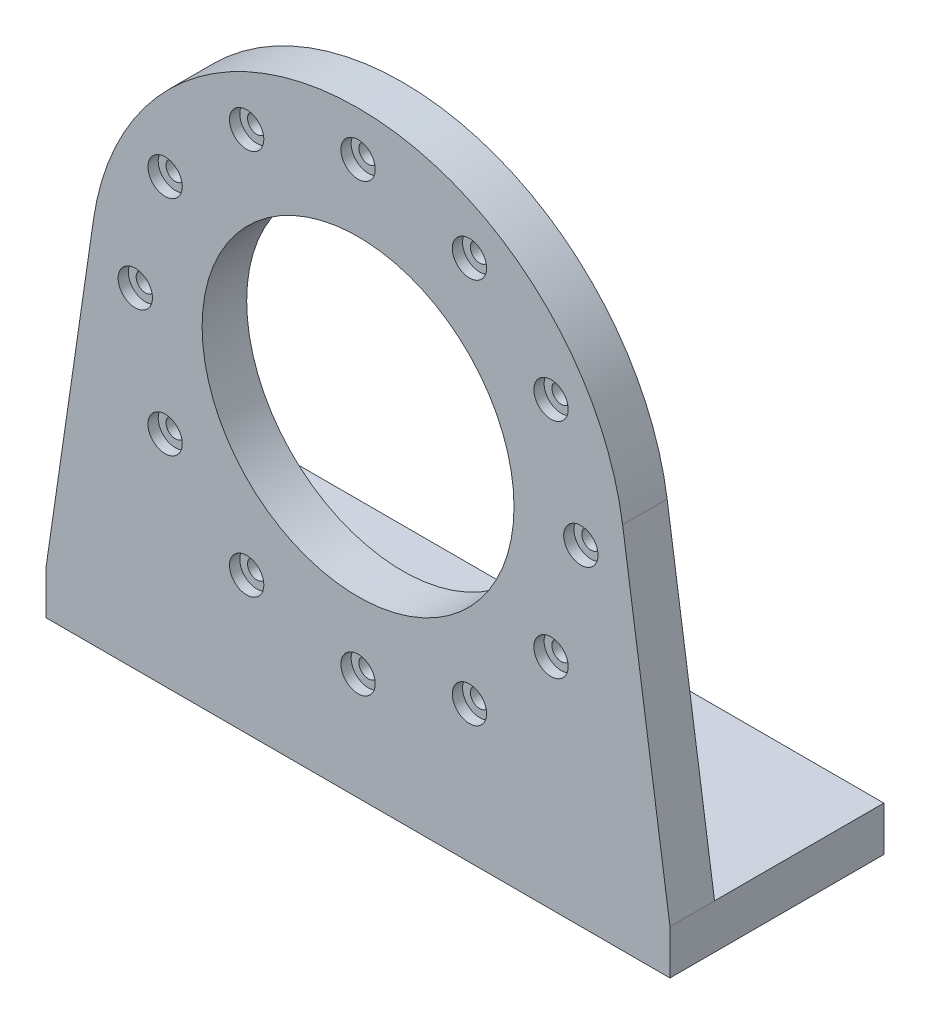
ISO-10303-21;
HEADER;
FILE_DESCRIPTION(('STEP AP214'),'2;1');
FILE_NAME('part.step','',(''),(''),'','','');
FILE_SCHEMA(('AUTOMOTIVE_DESIGN { 1 0 10303 214 1 1 1 1 }'));
ENDSEC;
DATA;
#1=APPLICATION_CONTEXT('core data for automotive mechanical design processes');
#2=APPLICATION_PROTOCOL_DEFINITION('international standard','automotive_design',2000,#1);
#3=PRODUCT_CONTEXT('',#1,'mechanical');
#4=PRODUCT('Part','Part','',(#3));
#5=PRODUCT_RELATED_PRODUCT_CATEGORY('part','',(#4));
#6=PRODUCT_DEFINITION_FORMATION('','',#4);
#7=PRODUCT_DEFINITION_CONTEXT('part definition',#1,'design');
#8=PRODUCT_DEFINITION('design','',#6,#7);
#9=PRODUCT_DEFINITION_SHAPE('','',#8);
#10=(LENGTH_UNIT() NAMED_UNIT(*) SI_UNIT(.MILLI.,.METRE.));
#11=(NAMED_UNIT(*) PLANE_ANGLE_UNIT() SI_UNIT($,.RADIAN.));
#12=(NAMED_UNIT(*) SI_UNIT($,.STERADIAN.) SOLID_ANGLE_UNIT());
#13=UNCERTAINTY_MEASURE_WITH_UNIT(LENGTH_MEASURE(1.E-05),#10,'distance_accuracy_value','');
#14=(GEOMETRIC_REPRESENTATION_CONTEXT(3) GLOBAL_UNCERTAINTY_ASSIGNED_CONTEXT((#13)) GLOBAL_UNIT_ASSIGNED_CONTEXT((#10,
#11,#12)) REPRESENTATION_CONTEXT('',''));
#15=CARTESIAN_POINT('',(0.,0.,0.));
#16=DIRECTION('',(0.,0.,1.));
#17=DIRECTION('',(1.,0.,0.));
#18=AXIS2_PLACEMENT_3D('',#15,#16,#17);
#19=CARTESIAN_POINT('',(-50.,0.,10.));
#20=DIRECTION('',(0.,0.,-1.));
#21=DIRECTION('',(-1.,0.,0.));
#22=AXIS2_PLACEMENT_3D('',#19,#20,#21);
#23=CYLINDRICAL_SURFACE('',#22,2.1);
#24=CARTESIAN_POINT('',(-50.,0.,0.));
#25=DIRECTION('',(0.,0.,1.));
#26=DIRECTION('',(1.,0.,0.));
#27=AXIS2_PLACEMENT_3D('',#24,#25,#26);
#28=CIRCLE('',#27,2.1);
#29=CARTESIAN_POINT('',(-47.9,0.,0.));
#30=VERTEX_POINT('',#29);
#31=EDGE_CURVE('E185',#30,#30,#28,.T.);
#32=ORIENTED_EDGE('',*,*,#31,.F.);
#33=EDGE_LOOP('',(#32));
#34=FACE_BOUND('',#33,.T.);
#35=CARTESIAN_POINT('',(-50.,0.,7.7));
#36=DIRECTION('',(0.,0.,1.));
#37=DIRECTION('',(1.,0.,0.));
#38=AXIS2_PLACEMENT_3D('',#35,#36,#37);
#39=CIRCLE('',#38,2.1);
#40=CARTESIAN_POINT('',(-47.9,0.,7.7));
#41=VERTEX_POINT('',#40);
#42=EDGE_CURVE('E43',#41,#41,#39,.T.);
#43=ORIENTED_EDGE('',*,*,#42,.T.);
#44=EDGE_LOOP('',(#43));
#45=FACE_BOUND('',#44,.T.);
#46=ADVANCED_FACE('F39',(#34,#45),#23,.F.);
#47=CARTESIAN_POINT('',(-43.3012701892219,25.,10.));
#48=DIRECTION('',(0.,0.,-1.));
#49=DIRECTION('',(-1.,0.,0.));
#50=AXIS2_PLACEMENT_3D('',#47,#48,#49);
#51=CYLINDRICAL_SURFACE('',#50,2.09999999999999);
#52=CARTESIAN_POINT('',(-43.3012701892219,25.,0.));
#53=DIRECTION('',(0.,0.,1.));
#54=DIRECTION('',(1.,0.,0.));
#55=AXIS2_PLACEMENT_3D('',#52,#53,#54);
#56=CIRCLE('',#55,2.09999999999999);
#57=CARTESIAN_POINT('',(-41.2012701892219,25.,0.));
#58=VERTEX_POINT('',#57);
#59=EDGE_CURVE('E182',#58,#58,#56,.T.);
#60=ORIENTED_EDGE('',*,*,#59,.F.);
#61=EDGE_LOOP('',(#60));
#62=FACE_BOUND('',#61,.T.);
#63=CARTESIAN_POINT('',(-43.3012701892219,25.,7.7));
#64=DIRECTION('',(0.,0.,1.));
#65=DIRECTION('',(1.,0.,0.));
#66=AXIS2_PLACEMENT_3D('',#63,#64,#65);
#67=CIRCLE('',#66,2.09999999999999);
#68=CARTESIAN_POINT('',(-41.2012701892219,25.,7.7));
#69=VERTEX_POINT('',#68);
#70=EDGE_CURVE('E241',#69,#69,#67,.T.);
#71=ORIENTED_EDGE('',*,*,#70,.T.);
#72=EDGE_LOOP('',(#71));
#73=FACE_BOUND('',#72,.T.);
#74=ADVANCED_FACE('F377',(#62,#73),#51,.F.);
#75=CARTESIAN_POINT('',(-25.,43.3012701892219,10.));
#76=DIRECTION('',(0.,0.,-1.));
#77=DIRECTION('',(-1.,0.,0.));
#78=AXIS2_PLACEMENT_3D('',#75,#76,#77);
#79=CYLINDRICAL_SURFACE('',#78,2.1);
#80=CARTESIAN_POINT('',(-25.,43.3012701892219,0.));
#81=DIRECTION('',(0.,0.,1.));
#82=DIRECTION('',(1.,0.,0.));
#83=AXIS2_PLACEMENT_3D('',#80,#81,#82);
#84=CIRCLE('',#83,2.1);
#85=CARTESIAN_POINT('',(-22.9,43.3012701892219,0.));
#86=VERTEX_POINT('',#85);
#87=EDGE_CURVE('E179',#86,#86,#84,.T.);
#88=ORIENTED_EDGE('',*,*,#87,.F.);
#89=EDGE_LOOP('',(#88));
#90=FACE_BOUND('',#89,.T.);
#91=CARTESIAN_POINT('',(-25.,43.3012701892219,7.7));
#92=DIRECTION('',(0.,0.,1.));
#93=DIRECTION('',(1.,0.,0.));
#94=AXIS2_PLACEMENT_3D('',#91,#92,#93);
#95=CIRCLE('',#94,2.1);
#96=CARTESIAN_POINT('',(-22.9,43.3012701892219,7.7));
#97=VERTEX_POINT('',#96);
#98=EDGE_CURVE('E239',#97,#97,#95,.T.);
#99=ORIENTED_EDGE('',*,*,#98,.T.);
#100=EDGE_LOOP('',(#99));
#101=FACE_BOUND('',#100,.T.);
#102=ADVANCED_FACE('F384',(#90,#101),#79,.F.);
#103=CARTESIAN_POINT('',(0.,50.,10.));
#104=DIRECTION('',(0.,0.,-1.));
#105=DIRECTION('',(-1.,0.,0.));
#106=AXIS2_PLACEMENT_3D('',#103,#104,#105);
#107=CYLINDRICAL_SURFACE('',#106,2.1);
#108=CARTESIAN_POINT('',(0.,50.,0.));
#109=DIRECTION('',(0.,0.,1.));
#110=DIRECTION('',(1.,0.,0.));
#111=AXIS2_PLACEMENT_3D('',#108,#109,#110);
#112=CIRCLE('',#111,2.1);
#113=CARTESIAN_POINT('',(2.09999999999999,50.,0.));
#114=VERTEX_POINT('',#113);
#115=EDGE_CURVE('E176',#114,#114,#112,.T.);
#116=ORIENTED_EDGE('',*,*,#115,.F.);
#117=EDGE_LOOP('',(#116));
#118=FACE_BOUND('',#117,.T.);
#119=CARTESIAN_POINT('',(0.,50.,7.7));
#120=DIRECTION('',(0.,0.,1.));
#121=DIRECTION('',(1.,0.,0.));
#122=AXIS2_PLACEMENT_3D('',#119,#120,#121);
#123=CIRCLE('',#122,2.1);
#124=CARTESIAN_POINT('',(2.09999999999999,50.,7.7));
#125=VERTEX_POINT('',#124);
#126=EDGE_CURVE('E236',#125,#125,#123,.T.);
#127=ORIENTED_EDGE('',*,*,#126,.T.);
#128=EDGE_LOOP('',(#127));
#129=FACE_BOUND('',#128,.T.);
#130=ADVANCED_FACE('F443',(#118,#129),#107,.F.);
#131=CARTESIAN_POINT('',(25.,43.3012701892219,10.));
#132=DIRECTION('',(0.,0.,-1.));
#133=DIRECTION('',(-1.,0.,0.));
#134=AXIS2_PLACEMENT_3D('',#131,#132,#133);
#135=CYLINDRICAL_SURFACE('',#134,2.1);
#136=CARTESIAN_POINT('',(25.,43.3012701892219,0.));
#137=DIRECTION('',(0.,0.,1.));
#138=DIRECTION('',(1.,0.,0.));
#139=AXIS2_PLACEMENT_3D('',#136,#137,#138);
#140=CIRCLE('',#139,2.1);
#141=CARTESIAN_POINT('',(27.1,43.3012701892219,0.));
#142=VERTEX_POINT('',#141);
#143=EDGE_CURVE('E173',#142,#142,#140,.T.);
#144=ORIENTED_EDGE('',*,*,#143,.F.);
#145=EDGE_LOOP('',(#144));
#146=FACE_BOUND('',#145,.T.);
#147=CARTESIAN_POINT('',(25.,43.3012701892219,7.7));
#148=DIRECTION('',(0.,0.,1.));
#149=DIRECTION('',(1.,0.,0.));
#150=AXIS2_PLACEMENT_3D('',#147,#148,#149);
#151=CIRCLE('',#150,2.1);
#152=CARTESIAN_POINT('',(27.1,43.3012701892219,7.7));
#153=VERTEX_POINT('',#152);
#154=EDGE_CURVE('E233',#153,#153,#151,.T.);
#155=ORIENTED_EDGE('',*,*,#154,.T.);
#156=EDGE_LOOP('',(#155));
#157=FACE_BOUND('',#156,.T.);
#158=ADVANCED_FACE('F439',(#146,#157),#135,.F.);
#159=CARTESIAN_POINT('',(43.3012701892219,25.,10.));
#160=DIRECTION('',(0.,0.,-1.));
#161=DIRECTION('',(-1.,0.,0.));
#162=AXIS2_PLACEMENT_3D('',#159,#160,#161);
#163=CYLINDRICAL_SURFACE('',#162,2.1);
#164=CARTESIAN_POINT('',(43.3012701892219,25.,0.));
#165=DIRECTION('',(0.,0.,1.));
#166=DIRECTION('',(1.,0.,0.));
#167=AXIS2_PLACEMENT_3D('',#164,#165,#166);
#168=CIRCLE('',#167,2.1);
#169=CARTESIAN_POINT('',(45.4012701892219,25.,0.));
#170=VERTEX_POINT('',#169);
#171=EDGE_CURVE('E170',#170,#170,#168,.T.);
#172=ORIENTED_EDGE('',*,*,#171,.F.);
#173=EDGE_LOOP('',(#172));
#174=FACE_BOUND('',#173,.T.);
#175=CARTESIAN_POINT('',(43.3012701892219,25.,7.7));
#176=DIRECTION('',(0.,0.,1.));
#177=DIRECTION('',(1.,0.,0.));
#178=AXIS2_PLACEMENT_3D('',#175,#176,#177);
#179=CIRCLE('',#178,2.1);
#180=CARTESIAN_POINT('',(45.4012701892219,25.,7.7));
#181=VERTEX_POINT('',#180);
#182=EDGE_CURVE('E230',#181,#181,#179,.T.);
#183=ORIENTED_EDGE('',*,*,#182,.T.);
#184=EDGE_LOOP('',(#183));
#185=FACE_BOUND('',#184,.T.);
#186=ADVANCED_FACE('F435',(#174,#185),#163,.F.);
#187=CARTESIAN_POINT('',(50.,0.,10.));
#188=DIRECTION('',(0.,0.,-1.));
#189=DIRECTION('',(-1.,0.,0.));
#190=AXIS2_PLACEMENT_3D('',#187,#188,#189);
#191=CYLINDRICAL_SURFACE('',#190,2.1);
#192=CARTESIAN_POINT('',(50.,0.,0.));
#193=DIRECTION('',(0.,0.,1.));
#194=DIRECTION('',(1.,0.,0.));
#195=AXIS2_PLACEMENT_3D('',#192,#193,#194);
#196=CIRCLE('',#195,2.1);
#197=CARTESIAN_POINT('',(52.1,0.,0.));
#198=VERTEX_POINT('',#197);
#199=EDGE_CURVE('E167',#198,#198,#196,.T.);
#200=ORIENTED_EDGE('',*,*,#199,.F.);
#201=EDGE_LOOP('',(#200));
#202=FACE_BOUND('',#201,.T.);
#203=CARTESIAN_POINT('',(50.,0.,7.7));
#204=DIRECTION('',(0.,0.,1.));
#205=DIRECTION('',(1.,0.,0.));
#206=AXIS2_PLACEMENT_3D('',#203,#204,#205);
#207=CIRCLE('',#206,2.1);
#208=CARTESIAN_POINT('',(52.1,0.,7.7));
#209=VERTEX_POINT('',#208);
#210=EDGE_CURVE('E227',#209,#209,#207,.T.);
#211=ORIENTED_EDGE('',*,*,#210,.T.);
#212=EDGE_LOOP('',(#211));
#213=FACE_BOUND('',#212,.T.);
#214=ADVANCED_FACE('F431',(#202,#213),#191,.F.);
#215=CARTESIAN_POINT('',(43.3012701892219,-25.,10.));
#216=DIRECTION('',(0.,0.,-1.));
#217=DIRECTION('',(-1.,0.,0.));
#218=AXIS2_PLACEMENT_3D('',#215,#216,#217);
#219=CYLINDRICAL_SURFACE('',#218,2.1);
#220=CARTESIAN_POINT('',(43.3012701892219,-25.,0.));
#221=DIRECTION('',(0.,0.,1.));
#222=DIRECTION('',(1.,0.,0.));
#223=AXIS2_PLACEMENT_3D('',#220,#221,#222);
#224=CIRCLE('',#223,2.1);
#225=CARTESIAN_POINT('',(45.4012701892219,-25.,0.));
#226=VERTEX_POINT('',#225);
#227=EDGE_CURVE('E164',#226,#226,#224,.T.);
#228=ORIENTED_EDGE('',*,*,#227,.F.);
#229=EDGE_LOOP('',(#228));
#230=FACE_BOUND('',#229,.T.);
#231=CARTESIAN_POINT('',(43.3012701892219,-25.,7.7));
#232=DIRECTION('',(0.,0.,1.));
#233=DIRECTION('',(1.,0.,0.));
#234=AXIS2_PLACEMENT_3D('',#231,#232,#233);
#235=CIRCLE('',#234,2.1);
#236=CARTESIAN_POINT('',(45.4012701892219,-25.,7.7));
#237=VERTEX_POINT('',#236);
#238=EDGE_CURVE('E224',#237,#237,#235,.T.);
#239=ORIENTED_EDGE('',*,*,#238,.T.);
#240=EDGE_LOOP('',(#239));
#241=FACE_BOUND('',#240,.T.);
#242=ADVANCED_FACE('F427',(#230,#241),#219,.F.);
#243=CARTESIAN_POINT('',(25.,-43.3012701892219,10.));
#244=DIRECTION('',(0.,0.,-1.));
#245=DIRECTION('',(-1.,0.,0.));
#246=AXIS2_PLACEMENT_3D('',#243,#244,#245);
#247=CYLINDRICAL_SURFACE('',#246,2.10000000000001);
#248=CARTESIAN_POINT('',(25.,-43.3012701892219,0.));
#249=DIRECTION('',(0.,0.,1.));
#250=DIRECTION('',(1.,0.,0.));
#251=AXIS2_PLACEMENT_3D('',#248,#249,#250);
#252=CIRCLE('',#251,2.10000000000001);
#253=CARTESIAN_POINT('',(27.1,-43.3012701892219,0.));
#254=VERTEX_POINT('',#253);
#255=EDGE_CURVE('E161',#254,#254,#252,.T.);
#256=ORIENTED_EDGE('',*,*,#255,.F.);
#257=EDGE_LOOP('',(#256));
#258=FACE_BOUND('',#257,.T.);
#259=CARTESIAN_POINT('',(25.,-43.3012701892219,7.7));
#260=DIRECTION('',(0.,0.,1.));
#261=DIRECTION('',(1.,0.,0.));
#262=AXIS2_PLACEMENT_3D('',#259,#260,#261);
#263=CIRCLE('',#262,2.10000000000001);
#264=CARTESIAN_POINT('',(27.1,-43.3012701892219,7.7));
#265=VERTEX_POINT('',#264);
#266=EDGE_CURVE('E221',#265,#265,#263,.T.);
#267=ORIENTED_EDGE('',*,*,#266,.T.);
#268=EDGE_LOOP('',(#267));
#269=FACE_BOUND('',#268,.T.);
#270=ADVANCED_FACE('F423',(#258,#269),#247,.F.);
#271=CARTESIAN_POINT('',(0.,-50.,10.));
#272=DIRECTION('',(0.,0.,-1.));
#273=DIRECTION('',(-1.,0.,0.));
#274=AXIS2_PLACEMENT_3D('',#271,#272,#273);
#275=CYLINDRICAL_SURFACE('',#274,2.1);
#276=CARTESIAN_POINT('',(0.,-50.,0.));
#277=DIRECTION('',(0.,0.,1.));
#278=DIRECTION('',(1.,0.,0.));
#279=AXIS2_PLACEMENT_3D('',#276,#277,#278);
#280=CIRCLE('',#279,2.1);
#281=CARTESIAN_POINT('',(2.10000000000001,-50.,0.));
#282=VERTEX_POINT('',#281);
#283=EDGE_CURVE('E158',#282,#282,#280,.T.);
#284=ORIENTED_EDGE('',*,*,#283,.F.);
#285=EDGE_LOOP('',(#284));
#286=FACE_BOUND('',#285,.T.);
#287=CARTESIAN_POINT('',(0.,-50.,7.7));
#288=DIRECTION('',(0.,0.,1.));
#289=DIRECTION('',(1.,0.,0.));
#290=AXIS2_PLACEMENT_3D('',#287,#288,#289);
#291=CIRCLE('',#290,2.1);
#292=CARTESIAN_POINT('',(2.10000000000001,-50.,7.7));
#293=VERTEX_POINT('',#292);
#294=EDGE_CURVE('E218',#293,#293,#291,.T.);
#295=ORIENTED_EDGE('',*,*,#294,.T.);
#296=EDGE_LOOP('',(#295));
#297=FACE_BOUND('',#296,.T.);
#298=ADVANCED_FACE('F419',(#286,#297),#275,.F.);
#299=CARTESIAN_POINT('',(-25.,-43.301270189222,10.));
#300=DIRECTION('',(0.,0.,-1.));
#301=DIRECTION('',(-1.,0.,0.));
#302=AXIS2_PLACEMENT_3D('',#299,#300,#301);
#303=CYLINDRICAL_SURFACE('',#302,2.09999999999998);
#304=CARTESIAN_POINT('',(-25.,-43.301270189222,0.));
#305=DIRECTION('',(0.,0.,1.));
#306=DIRECTION('',(1.,0.,0.));
#307=AXIS2_PLACEMENT_3D('',#304,#305,#306);
#308=CIRCLE('',#307,2.09999999999998);
#309=CARTESIAN_POINT('',(-22.9,-43.301270189222,0.));
#310=VERTEX_POINT('',#309);
#311=EDGE_CURVE('E155',#310,#310,#308,.T.);
#312=ORIENTED_EDGE('',*,*,#311,.F.);
#313=EDGE_LOOP('',(#312));
#314=FACE_BOUND('',#313,.T.);
#315=CARTESIAN_POINT('',(-25.,-43.301270189222,7.7));
#316=DIRECTION('',(0.,0.,1.));
#317=DIRECTION('',(1.,0.,0.));
#318=AXIS2_PLACEMENT_3D('',#315,#316,#317);
#319=CIRCLE('',#318,2.09999999999998);
#320=CARTESIAN_POINT('',(-22.9,-43.301270189222,7.7));
#321=VERTEX_POINT('',#320);
#322=EDGE_CURVE('E214',#321,#321,#319,.T.);
#323=ORIENTED_EDGE('',*,*,#322,.T.);
#324=EDGE_LOOP('',(#323));
#325=FACE_BOUND('',#324,.T.);
#326=ADVANCED_FACE('F362',(#314,#325),#303,.F.);
#327=CARTESIAN_POINT('',(-43.3012701892219,-25.,10.));
#328=DIRECTION('',(0.,0.,-1.));
#329=DIRECTION('',(-1.,0.,0.));
#330=AXIS2_PLACEMENT_3D('',#327,#328,#329);
#331=CYLINDRICAL_SURFACE('',#330,2.1);
#332=CARTESIAN_POINT('',(-43.3012701892219,-25.,0.));
#333=DIRECTION('',(0.,0.,1.));
#334=DIRECTION('',(1.,0.,0.));
#335=AXIS2_PLACEMENT_3D('',#332,#333,#334);
#336=CIRCLE('',#335,2.1);
#337=CARTESIAN_POINT('',(-41.2012701892219,-25.,0.));
#338=VERTEX_POINT('',#337);
#339=EDGE_CURVE('E148',#338,#338,#336,.T.);
#340=ORIENTED_EDGE('',*,*,#339,.F.);
#341=EDGE_LOOP('',(#340));
#342=FACE_BOUND('',#341,.T.);
#343=CARTESIAN_POINT('',(-43.3012701892219,-25.,7.7));
#344=DIRECTION('',(0.,0.,1.));
#345=DIRECTION('',(1.,0.,0.));
#346=AXIS2_PLACEMENT_3D('',#343,#344,#345);
#347=CIRCLE('',#346,2.1);
#348=CARTESIAN_POINT('',(-41.2012701892219,-25.,7.7));
#349=VERTEX_POINT('',#348);
#350=EDGE_CURVE('E211',#349,#349,#347,.T.);
#351=ORIENTED_EDGE('',*,*,#350,.T.);
#352=EDGE_LOOP('',(#351));
#353=FACE_BOUND('',#352,.T.);
#354=ADVANCED_FACE('F306',(#342,#353),#331,.F.);
#355=CARTESIAN_POINT('',(0.,0.,10.));
#356=DIRECTION('',(0.,0.,1.));
#357=DIRECTION('',(1.,0.,0.));
#358=AXIS2_PLACEMENT_3D('',#355,#356,#357);
#359=PLANE('',#358);
#360=CARTESIAN_POINT('',(43.3012701892219,25.,10.));
#361=DIRECTION('',(0.,0.,1.));
#362=DIRECTION('',(1.,0.,0.));
#363=AXIS2_PLACEMENT_3D('',#360,#361,#362);
#364=CIRCLE('',#363,3.85000000000001);
#365=CARTESIAN_POINT('',(47.1512701892219,25.,10.));
#366=VERTEX_POINT('',#365);
#367=EDGE_CURVE('E480',#366,#366,#364,.T.);
#368=ORIENTED_EDGE('',*,*,#367,.F.);
#369=EDGE_LOOP('',(#368));
#370=FACE_BOUND('',#369,.T.);
#371=CARTESIAN_POINT('',(25.,43.301270189222,10.));
#372=DIRECTION('',(0.,0.,1.));
#373=DIRECTION('',(1.,0.,0.));
#374=AXIS2_PLACEMENT_3D('',#371,#372,#373);
#375=CIRCLE('',#374,3.85);
#376=CARTESIAN_POINT('',(28.85,43.301270189222,10.));
#377=VERTEX_POINT('',#376);
#378=EDGE_CURVE('E475',#377,#377,#375,.T.);
#379=ORIENTED_EDGE('',*,*,#378,.F.);
#380=EDGE_LOOP('',(#379));
#381=FACE_BOUND('',#380,.T.);
#382=CARTESIAN_POINT('',(0.,50.,10.));
#383=DIRECTION('',(0.,0.,1.));
#384=DIRECTION('',(1.,0.,0.));
#385=AXIS2_PLACEMENT_3D('',#382,#383,#384);
#386=CIRCLE('',#385,3.85);
#387=CARTESIAN_POINT('',(3.84999999999998,50.,10.));
#388=VERTEX_POINT('',#387);
#389=EDGE_CURVE('E464',#388,#388,#386,.T.);
#390=ORIENTED_EDGE('',*,*,#389,.F.);
#391=EDGE_LOOP('',(#390));
#392=FACE_BOUND('',#391,.T.);
#393=CARTESIAN_POINT('',(-25.,43.3012701892219,10.));
#394=DIRECTION('',(0.,0.,1.));
#395=DIRECTION('',(1.,0.,0.));
#396=AXIS2_PLACEMENT_3D('',#393,#394,#395);
#397=CIRCLE('',#396,3.85);
#398=CARTESIAN_POINT('',(-21.15,43.3012701892219,10.));
#399=VERTEX_POINT('',#398);
#400=EDGE_CURVE('E270',#399,#399,#397,.T.);
#401=ORIENTED_EDGE('',*,*,#400,.F.);
#402=EDGE_LOOP('',(#401));
#403=FACE_BOUND('',#402,.T.);
#404=CARTESIAN_POINT('',(-43.301270189222,25.,10.));
#405=DIRECTION('',(0.,0.,1.));
#406=DIRECTION('',(1.,0.,0.));
#407=AXIS2_PLACEMENT_3D('',#404,#405,#406);
#408=CIRCLE('',#407,3.85);
#409=CARTESIAN_POINT('',(-39.451270189222,25.,10.));
#410=VERTEX_POINT('',#409);
#411=EDGE_CURVE('E259',#410,#410,#408,.T.);
#412=ORIENTED_EDGE('',*,*,#411,.F.);
#413=EDGE_LOOP('',(#412));
#414=FACE_BOUND('',#413,.T.);
#415=CARTESIAN_POINT('',(-50.,0.,10.));
#416=DIRECTION('',(0.,0.,1.));
#417=DIRECTION('',(1.,0.,0.));
#418=AXIS2_PLACEMENT_3D('',#415,#416,#417);
#419=CIRCLE('',#418,3.85);
#420=CARTESIAN_POINT('',(-46.15,0.,10.));
#421=VERTEX_POINT('',#420);
#422=EDGE_CURVE('E258',#421,#421,#419,.T.);
#423=ORIENTED_EDGE('',*,*,#422,.F.);
#424=EDGE_LOOP('',(#423));
#425=FACE_BOUND('',#424,.T.);
#426=CARTESIAN_POINT('',(-43.3012701892219,-25.,10.));
#427=DIRECTION('',(0.,0.,1.));
#428=DIRECTION('',(1.,0.,0.));
#429=AXIS2_PLACEMENT_3D('',#426,#427,#428);
#430=CIRCLE('',#429,3.85);
#431=CARTESIAN_POINT('',(-39.4512701892219,-25.,10.));
#432=VERTEX_POINT('',#431);
#433=EDGE_CURVE('E284',#432,#432,#430,.T.);
#434=ORIENTED_EDGE('',*,*,#433,.F.);
#435=EDGE_LOOP('',(#434));
#436=FACE_BOUND('',#435,.T.);
#437=CARTESIAN_POINT('',(-25.,-43.3012701892219,10.));
#438=DIRECTION('',(0.,0.,1.));
#439=DIRECTION('',(1.,0.,0.));
#440=AXIS2_PLACEMENT_3D('',#437,#438,#439);
#441=CIRCLE('',#440,3.85);
#442=CARTESIAN_POINT('',(-21.15,-43.3012701892219,10.));
#443=VERTEX_POINT('',#442);
#444=EDGE_CURVE('E275',#443,#443,#441,.T.);
#445=ORIENTED_EDGE('',*,*,#444,.F.);
#446=EDGE_LOOP('',(#445));
#447=FACE_BOUND('',#446,.T.);
#448=CARTESIAN_POINT('',(50.,0.,10.));
#449=DIRECTION('',(0.,0.,1.));
#450=DIRECTION('',(1.,0.,0.));
#451=AXIS2_PLACEMENT_3D('',#448,#449,#450);
#452=CIRCLE('',#451,3.85);
#453=CARTESIAN_POINT('',(53.85,0.,10.));
#454=VERTEX_POINT('',#453);
#455=EDGE_CURVE('E313',#454,#454,#452,.T.);
#456=ORIENTED_EDGE('',*,*,#455,.F.);
#457=EDGE_LOOP('',(#456));
#458=FACE_BOUND('',#457,.T.);
#459=CARTESIAN_POINT('',(43.301270189222,-25.,10.));
#460=DIRECTION('',(0.,0.,1.));
#461=DIRECTION('',(1.,0.,0.));
#462=AXIS2_PLACEMENT_3D('',#459,#460,#461);
#463=CIRCLE('',#462,3.85000000000001);
#464=CARTESIAN_POINT('',(47.151270189222,-25.,10.));
#465=VERTEX_POINT('',#464);
#466=EDGE_CURVE('E317',#465,#465,#463,.T.);
#467=ORIENTED_EDGE('',*,*,#466,.F.);
#468=EDGE_LOOP('',(#467));
#469=FACE_BOUND('',#468,.T.);
#470=CARTESIAN_POINT('',(25.0000000000001,-43.3012701892219,10.));
#471=DIRECTION('',(0.,0.,1.));
#472=DIRECTION('',(1.,0.,0.));
#473=AXIS2_PLACEMENT_3D('',#470,#471,#472);
#474=CIRCLE('',#473,3.85);
#475=CARTESIAN_POINT('',(28.8500000000001,-43.3012701892219,10.));
#476=VERTEX_POINT('',#475);
#477=EDGE_CURVE('E321',#476,#476,#474,.T.);
#478=ORIENTED_EDGE('',*,*,#477,.F.);
#479=EDGE_LOOP('',(#478));
#480=FACE_BOUND('',#479,.T.);
#481=CARTESIAN_POINT('',(0.,-50.,10.));
#482=DIRECTION('',(0.,0.,1.));
#483=DIRECTION('',(1.,0.,0.));
#484=AXIS2_PLACEMENT_3D('',#481,#482,#483);
#485=CIRCLE('',#484,3.85);
#486=CARTESIAN_POINT('',(3.85000000000001,-50.,10.));
#487=VERTEX_POINT('',#486);
#488=EDGE_CURVE('E139',#487,#487,#485,.T.);
#489=ORIENTED_EDGE('',*,*,#488,.F.);
#490=EDGE_LOOP('',(#489));
#491=FACE_BOUND('',#490,.T.);
#492=DIRECTION('',(-0.144538830520541,-0.989499129090953,0.));
#493=VECTOR('',#492,1.);
#494=CARTESIAN_POINT('',(-70.,-64.1,10.));
#495=LINE('',#494,#493);
#496=CARTESIAN_POINT('',(-59.3699477454572,8.67232983123248,10.));
#497=VERTEX_POINT('',#496);
#498=CARTESIAN_POINT('',(-70.,-64.1,10.));
#499=VERTEX_POINT('',#498);
#500=EDGE_CURVE('E84',#497,#499,#495,.T.);
#501=ORIENTED_EDGE('',*,*,#500,.T.);
#502=DIRECTION('',(0.,-1.,0.));
#503=VECTOR('',#502,1.);
#504=CARTESIAN_POINT('',(-70.,-64.1,10.));
#505=LINE('',#504,#503);
#506=CARTESIAN_POINT('',(-70.,-74.1,10.));
#507=VERTEX_POINT('',#506);
#508=EDGE_CURVE('E144',#499,#507,#505,.T.);
#509=ORIENTED_EDGE('',*,*,#508,.T.);
#510=DIRECTION('',(1.,0.,0.));
#511=VECTOR('',#510,1.);
#512=CARTESIAN_POINT('',(-70.,-74.1,10.));
#513=LINE('',#512,#511);
#514=CARTESIAN_POINT('',(70.,-74.1,10.));
#515=VERTEX_POINT('',#514);
#516=EDGE_CURVE('E114',#507,#515,#513,.T.);
#517=ORIENTED_EDGE('',*,*,#516,.T.);
#518=DIRECTION('',(0.,1.,0.));
#519=VECTOR('',#518,1.);
#520=CARTESIAN_POINT('',(70.,-64.1,10.));
#521=LINE('',#520,#519);
#522=CARTESIAN_POINT('',(70.,-64.1,10.));
#523=VERTEX_POINT('',#522);
#524=EDGE_CURVE('E134',#515,#523,#521,.T.);
#525=ORIENTED_EDGE('',*,*,#524,.T.);
#526=DIRECTION('',(-0.144538830520542,0.989499129090953,0.));
#527=VECTOR('',#526,1.);
#528=CARTESIAN_POINT('',(70.,-64.1,10.));
#529=LINE('',#528,#527);
#530=CARTESIAN_POINT('',(59.3699477454572,8.6723298312325,10.));
#531=VERTEX_POINT('',#530);
#532=EDGE_CURVE('E196',#523,#531,#529,.T.);
#533=ORIENTED_EDGE('',*,*,#532,.T.);
#534=CARTESIAN_POINT('',(0.,0.,10.));
#535=DIRECTION('',(0.,0.,1.));
#536=DIRECTION('',(1.,0.,0.));
#537=AXIS2_PLACEMENT_3D('',#534,#535,#536);
#538=CIRCLE('',#537,60.);
#539=EDGE_CURVE('E58',#531,#497,#538,.T.);
#540=ORIENTED_EDGE('',*,*,#539,.T.);
#541=EDGE_LOOP('',(#501,#509,#517,#525,#533,#540));
#542=FACE_BOUND('',#541,.T.);
#543=CARTESIAN_POINT('',(0.,0.,10.));
#544=DIRECTION('',(0.,0.,1.));
#545=DIRECTION('',(1.,0.,0.));
#546=AXIS2_PLACEMENT_3D('',#543,#544,#545);
#547=CIRCLE('',#546,35.);
#548=CARTESIAN_POINT('',(35.,0.,10.));
#549=VERTEX_POINT('',#548);
#550=EDGE_CURVE('E189',#549,#549,#547,.T.);
#551=ORIENTED_EDGE('',*,*,#550,.F.);
#552=EDGE_LOOP('',(#551));
#553=FACE_BOUND('',#552,.T.);
#554=ADVANCED_FACE('F302',(#370,#381,#392,#403,#414,#425,#436,#447,#458,#469,#480,#491,#542,
#553),#359,.T.);
#555=CARTESIAN_POINT('',(0.,0.,0.));
#556=DIRECTION('',(0.,0.,1.));
#557=DIRECTION('',(1.,0.,0.));
#558=AXIS2_PLACEMENT_3D('',#555,#556,#557);
#559=PLANE('',#558);
#560=DIRECTION('',(-0.144538830520541,-0.989499129090953,0.));
#561=VECTOR('',#560,1.);
#562=CARTESIAN_POINT('',(-70.,-64.1,0.));
#563=LINE('',#562,#561);
#564=CARTESIAN_POINT('',(-59.3699477454572,8.67232983123248,0.));
#565=VERTEX_POINT('',#564);
#566=CARTESIAN_POINT('',(-70.,-64.1,0.));
#567=VERTEX_POINT('',#566);
#568=EDGE_CURVE('E192',#565,#567,#563,.T.);
#569=ORIENTED_EDGE('',*,*,#568,.F.);
#570=CARTESIAN_POINT('',(0.,0.,0.));
#571=DIRECTION('',(0.,0.,1.));
#572=DIRECTION('',(1.,0.,0.));
#573=AXIS2_PLACEMENT_3D('',#570,#571,#572);
#574=CIRCLE('',#573,60.);
#575=CARTESIAN_POINT('',(59.3699477454572,8.6723298312325,0.));
#576=VERTEX_POINT('',#575);
#577=EDGE_CURVE('E79',#576,#565,#574,.T.);
#578=ORIENTED_EDGE('',*,*,#577,.F.);
#579=DIRECTION('',(-0.144538830520542,0.989499129090953,0.));
#580=VECTOR('',#579,1.);
#581=CARTESIAN_POINT('',(70.,-64.1,0.));
#582=LINE('',#581,#580);
#583=CARTESIAN_POINT('',(70.,-64.1,0.));
#584=VERTEX_POINT('',#583);
#585=EDGE_CURVE('E73',#584,#576,#582,.T.);
#586=ORIENTED_EDGE('',*,*,#585,.F.);
#587=DIRECTION('',(1.,0.,0.));
#588=VECTOR('',#587,1.);
#589=CARTESIAN_POINT('',(0.,-64.1,0.));
#590=LINE('',#589,#588);
#591=EDGE_CURVE('E202',#567,#584,#590,.T.);
#592=ORIENTED_EDGE('',*,*,#591,.F.);
#593=EDGE_LOOP('',(#569,#578,#586,#592));
#594=FACE_BOUND('',#593,.T.);
#595=CARTESIAN_POINT('',(0.,0.,0.));
#596=DIRECTION('',(0.,0.,1.));
#597=DIRECTION('',(1.,0.,0.));
#598=AXIS2_PLACEMENT_3D('',#595,#596,#597);
#599=CIRCLE('',#598,35.);
#600=CARTESIAN_POINT('',(35.,0.,0.));
#601=VERTEX_POINT('',#600);
#602=EDGE_CURVE('E188',#601,#601,#599,.T.);
#603=ORIENTED_EDGE('',*,*,#602,.T.);
#604=EDGE_LOOP('',(#603));
#605=FACE_BOUND('',#604,.T.);
#606=ORIENTED_EDGE('',*,*,#31,.T.);
#607=EDGE_LOOP('',(#606));
#608=FACE_BOUND('',#607,.T.);
#609=ORIENTED_EDGE('',*,*,#59,.T.);
#610=EDGE_LOOP('',(#609));
#611=FACE_BOUND('',#610,.T.);
#612=ORIENTED_EDGE('',*,*,#87,.T.);
#613=EDGE_LOOP('',(#612));
#614=FACE_BOUND('',#613,.T.);
#615=ORIENTED_EDGE('',*,*,#115,.T.);
#616=EDGE_LOOP('',(#615));
#617=FACE_BOUND('',#616,.T.);
#618=ORIENTED_EDGE('',*,*,#143,.T.);
#619=EDGE_LOOP('',(#618));
#620=FACE_BOUND('',#619,.T.);
#621=ORIENTED_EDGE('',*,*,#171,.T.);
#622=EDGE_LOOP('',(#621));
#623=FACE_BOUND('',#622,.T.);
#624=ORIENTED_EDGE('',*,*,#199,.T.);
#625=EDGE_LOOP('',(#624));
#626=FACE_BOUND('',#625,.T.);
#627=ORIENTED_EDGE('',*,*,#227,.T.);
#628=EDGE_LOOP('',(#627));
#629=FACE_BOUND('',#628,.T.);
#630=ORIENTED_EDGE('',*,*,#255,.T.);
#631=EDGE_LOOP('',(#630));
#632=FACE_BOUND('',#631,.T.);
#633=ORIENTED_EDGE('',*,*,#283,.T.);
#634=EDGE_LOOP('',(#633));
#635=FACE_BOUND('',#634,.T.);
#636=ORIENTED_EDGE('',*,*,#311,.T.);
#637=EDGE_LOOP('',(#636));
#638=FACE_BOUND('',#637,.T.);
#639=ORIENTED_EDGE('',*,*,#339,.T.);
#640=EDGE_LOOP('',(#639));
#641=FACE_BOUND('',#640,.T.);
#642=ADVANCED_FACE('F305',(#594,#605,#608,#611,#614,#617,#620,#623,#626,#629,#632,#635,#638,
#641),#559,.F.);
#643=CARTESIAN_POINT('',(-70.,-64.1,10.));
#644=DIRECTION('',(0.989499129090953,-0.144538830520541,0.));
#645=DIRECTION('',(0.144538830520541,0.989499129090953,0.));
#646=AXIS2_PLACEMENT_3D('',#643,#644,#645);
#647=PLANE('',#646);
#648=ORIENTED_EDGE('',*,*,#568,.T.);
#649=DIRECTION('',(0.,0.,-1.));
#650=VECTOR('',#649,1.);
#651=CARTESIAN_POINT('',(-70.,-64.1,10.));
#652=LINE('',#651,#650);
#653=EDGE_CURVE('E11',#499,#567,#652,.T.);
#654=ORIENTED_EDGE('',*,*,#653,.F.);
#655=ORIENTED_EDGE('',*,*,#500,.F.);
#656=DIRECTION('',(0.,0.,-1.));
#657=VECTOR('',#656,1.);
#658=CARTESIAN_POINT('',(-59.3699477454572,8.67232983123248,10.));
#659=LINE('',#658,#657);
#660=EDGE_CURVE('E199',#497,#565,#659,.T.);
#661=ORIENTED_EDGE('',*,*,#660,.T.);
#662=EDGE_LOOP('',(#648,#654,#655,#661));
#663=FACE_BOUND('',#662,.T.);
#664=ADVANCED_FACE('F41',(#663),#647,.F.);
#665=CARTESIAN_POINT('',(70.,-64.1,10.));
#666=DIRECTION('',(-0.989499129090953,-0.144538830520542,0.));
#667=DIRECTION('',(0.144538830520542,-0.989499129090953,0.));
#668=AXIS2_PLACEMENT_3D('',#665,#666,#667);
#669=PLANE('',#668);
#670=ORIENTED_EDGE('',*,*,#585,.T.);
#671=DIRECTION('',(0.,0.,-1.));
#672=VECTOR('',#671,1.);
#673=CARTESIAN_POINT('',(59.3699477454572,8.6723298312325,10.));
#674=LINE('',#673,#672);
#675=EDGE_CURVE('E208',#531,#576,#674,.T.);
#676=ORIENTED_EDGE('',*,*,#675,.F.);
#677=ORIENTED_EDGE('',*,*,#532,.F.);
#678=DIRECTION('',(0.,0.,-1.));
#679=VECTOR('',#678,1.);
#680=CARTESIAN_POINT('',(70.,-64.1,10.));
#681=LINE('',#680,#679);
#682=EDGE_CURVE('E49',#523,#584,#681,.T.);
#683=ORIENTED_EDGE('',*,*,#682,.T.);
#684=EDGE_LOOP('',(#670,#676,#677,#683));
#685=FACE_BOUND('',#684,.T.);
#686=ADVANCED_FACE('F390',(#685),#669,.F.);
#687=CARTESIAN_POINT('',(0.,0.,10.));
#688=DIRECTION('',(0.,0.,-1.));
#689=DIRECTION('',(-1.,0.,0.));
#690=AXIS2_PLACEMENT_3D('',#687,#688,#689);
#691=CYLINDRICAL_SURFACE('',#690,60.);
#692=ORIENTED_EDGE('',*,*,#577,.T.);
#693=ORIENTED_EDGE('',*,*,#660,.F.);
#694=ORIENTED_EDGE('',*,*,#539,.F.);
#695=ORIENTED_EDGE('',*,*,#675,.T.);
#696=EDGE_LOOP('',(#692,#693,#694,#695));
#697=FACE_BOUND('',#696,.T.);
#698=ADVANCED_FACE('F328',(#697),#691,.T.);
#699=CARTESIAN_POINT('',(0.,0.,10.));
#700=DIRECTION('',(0.,0.,-1.));
#701=DIRECTION('',(-1.,0.,0.));
#702=AXIS2_PLACEMENT_3D('',#699,#700,#701);
#703=CYLINDRICAL_SURFACE('',#702,35.);
#704=ORIENTED_EDGE('',*,*,#550,.T.);
#705=EDGE_LOOP('',(#704));
#706=FACE_BOUND('',#705,.T.);
#707=ORIENTED_EDGE('',*,*,#602,.F.);
#708=EDGE_LOOP('',(#707));
#709=FACE_BOUND('',#708,.T.);
#710=ADVANCED_FACE('F325',(#706,#709),#703,.F.);
#711=CARTESIAN_POINT('',(-70.,-64.1,-38.));
#712=DIRECTION('',(-1.,0.,0.));
#713=DIRECTION('',(0.,0.,1.));
#714=AXIS2_PLACEMENT_3D('',#711,#712,#713);
#715=PLANE('',#714);
#716=ORIENTED_EDGE('',*,*,#508,.F.);
#717=ORIENTED_EDGE('',*,*,#653,.T.);
#718=DIRECTION('',(0.,0.,1.));
#719=VECTOR('',#718,1.);
#720=CARTESIAN_POINT('',(-70.,-64.1,-38.));
#721=LINE('',#720,#719);
#722=CARTESIAN_POINT('',(-70.,-64.1,-38.));
#723=VERTEX_POINT('',#722);
#724=EDGE_CURVE('E133',#723,#567,#721,.T.);
#725=ORIENTED_EDGE('',*,*,#724,.F.);
#726=DIRECTION('',(0.,-1.,0.));
#727=VECTOR('',#726,1.);
#728=CARTESIAN_POINT('',(-70.,-64.1,-38.));
#729=LINE('',#728,#727);
#730=CARTESIAN_POINT('',(-70.,-74.1,-38.));
#731=VERTEX_POINT('',#730);
#732=EDGE_CURVE('E126',#723,#731,#729,.T.);
#733=ORIENTED_EDGE('',*,*,#732,.T.);
#734=DIRECTION('',(0.,0.,1.));
#735=VECTOR('',#734,1.);
#736=CARTESIAN_POINT('',(-70.,-74.1,-38.));
#737=LINE('',#736,#735);
#738=EDGE_CURVE('E109',#731,#507,#737,.T.);
#739=ORIENTED_EDGE('',*,*,#738,.T.);
#740=EDGE_LOOP('',(#716,#717,#725,#733,#739));
#741=FACE_BOUND('',#740,.T.);
#742=ADVANCED_FACE('F131',(#741),#715,.T.);
#743=CARTESIAN_POINT('',(-70.,-64.1,-38.));
#744=DIRECTION('',(0.,1.,0.));
#745=DIRECTION('',(0.,0.,1.));
#746=AXIS2_PLACEMENT_3D('',#743,#744,#745);
#747=PLANE('',#746);
#748=ORIENTED_EDGE('',*,*,#724,.T.);
#749=ORIENTED_EDGE('',*,*,#591,.T.);
#750=DIRECTION('',(0.,0.,1.));
#751=VECTOR('',#750,1.);
#752=CARTESIAN_POINT('',(70.,-64.1,-38.));
#753=LINE('',#752,#751);
#754=CARTESIAN_POINT('',(70.,-64.1,-38.));
#755=VERTEX_POINT('',#754);
#756=EDGE_CURVE('E149',#755,#584,#753,.T.);
#757=ORIENTED_EDGE('',*,*,#756,.F.);
#758=DIRECTION('',(-1.,0.,0.));
#759=VECTOR('',#758,1.);
#760=CARTESIAN_POINT('',(-70.,-64.1,-38.));
#761=LINE('',#760,#759);
#762=EDGE_CURVE('E119',#755,#723,#761,.T.);
#763=ORIENTED_EDGE('',*,*,#762,.T.);
#764=EDGE_LOOP('',(#748,#749,#757,#763));
#765=FACE_BOUND('',#764,.T.);
#766=ADVANCED_FACE('F401',(#765),#747,.T.);
#767=CARTESIAN_POINT('',(70.,-64.1,-38.));
#768=DIRECTION('',(1.,0.,0.));
#769=DIRECTION('',(0.,0.,-1.));
#770=AXIS2_PLACEMENT_3D('',#767,#768,#769);
#771=PLANE('',#770);
#772=ORIENTED_EDGE('',*,*,#524,.F.);
#773=DIRECTION('',(0.,0.,1.));
#774=VECTOR('',#773,1.);
#775=CARTESIAN_POINT('',(70.,-74.1,-38.));
#776=LINE('',#775,#774);
#777=CARTESIAN_POINT('',(70.,-74.1,-38.));
#778=VERTEX_POINT('',#777);
#779=EDGE_CURVE('E118',#778,#515,#776,.T.);
#780=ORIENTED_EDGE('',*,*,#779,.F.);
#781=DIRECTION('',(0.,1.,0.));
#782=VECTOR('',#781,1.);
#783=CARTESIAN_POINT('',(70.,-64.1,-38.));
#784=LINE('',#783,#782);
#785=EDGE_CURVE('E129',#778,#755,#784,.T.);
#786=ORIENTED_EDGE('',*,*,#785,.T.);
#787=ORIENTED_EDGE('',*,*,#756,.T.);
#788=ORIENTED_EDGE('',*,*,#682,.F.);
#789=EDGE_LOOP('',(#772,#780,#786,#787,#788));
#790=FACE_BOUND('',#789,.T.);
#791=ADVANCED_FACE('F405',(#790),#771,.T.);
#792=CARTESIAN_POINT('',(-70.,-74.1,-38.));
#793=DIRECTION('',(0.,-1.,0.));
#794=DIRECTION('',(1.,0.,0.));
#795=AXIS2_PLACEMENT_3D('',#792,#793,#794);
#796=PLANE('',#795);
#797=ORIENTED_EDGE('',*,*,#516,.F.);
#798=ORIENTED_EDGE('',*,*,#738,.F.);
#799=DIRECTION('',(1.,0.,0.));
#800=VECTOR('',#799,1.);
#801=CARTESIAN_POINT('',(-70.,-74.1,-38.));
#802=LINE('',#801,#800);
#803=EDGE_CURVE('E112',#731,#778,#802,.T.);
#804=ORIENTED_EDGE('',*,*,#803,.T.);
#805=ORIENTED_EDGE('',*,*,#779,.T.);
#806=EDGE_LOOP('',(#797,#798,#804,#805));
#807=FACE_BOUND('',#806,.T.);
#808=ADVANCED_FACE('F111',(#807),#796,.T.);
#809=CARTESIAN_POINT('',(0.,0.,-38.));
#810=DIRECTION('',(0.,0.,1.));
#811=DIRECTION('',(1.,0.,0.));
#812=AXIS2_PLACEMENT_3D('',#809,#810,#811);
#813=PLANE('',#812);
#814=ORIENTED_EDGE('',*,*,#732,.F.);
#815=ORIENTED_EDGE('',*,*,#762,.F.);
#816=ORIENTED_EDGE('',*,*,#785,.F.);
#817=ORIENTED_EDGE('',*,*,#803,.F.);
#818=EDGE_LOOP('',(#814,#815,#816,#817));
#819=FACE_BOUND('',#818,.T.);
#820=ADVANCED_FACE('F124',(#819),#813,.F.);
#821=CARTESIAN_POINT('',(-43.3012701892219,-25.,7.7));
#822=DIRECTION('',(0.,0.,1.));
#823=DIRECTION('',(1.,0.,0.));
#824=AXIS2_PLACEMENT_3D('',#821,#822,#823);
#825=CYLINDRICAL_SURFACE('',#824,3.85);
#826=CARTESIAN_POINT('',(-43.3012701892219,-25.,7.7));
#827=DIRECTION('',(0.,0.,1.));
#828=DIRECTION('',(1.,0.,0.));
#829=AXIS2_PLACEMENT_3D('',#826,#827,#828);
#830=CIRCLE('',#829,3.85);
#831=CARTESIAN_POINT('',(-39.4512701892219,-25.,7.7));
#832=VERTEX_POINT('',#831);
#833=EDGE_CURVE('E262',#832,#832,#830,.T.);
#834=ORIENTED_EDGE('',*,*,#833,.F.);
#835=EDGE_LOOP('',(#834));
#836=FACE_BOUND('',#835,.T.);
#837=ORIENTED_EDGE('',*,*,#433,.T.);
#838=EDGE_LOOP('',(#837));
#839=FACE_BOUND('',#838,.T.);
#840=ADVANCED_FACE('F296',(#836,#839),#825,.F.);
#841=CARTESIAN_POINT('',(-43.3012701892219,-25.,7.7));
#842=DIRECTION('',(0.,0.,1.));
#843=DIRECTION('',(1.,0.,0.));
#844=AXIS2_PLACEMENT_3D('',#841,#842,#843);
#845=PLANE('',#844);
#846=ORIENTED_EDGE('',*,*,#350,.F.);
#847=EDGE_LOOP('',(#846));
#848=FACE_BOUND('',#847,.T.);
#849=ORIENTED_EDGE('',*,*,#833,.T.);
#850=EDGE_LOOP('',(#849));
#851=FACE_BOUND('',#850,.T.);
#852=ADVANCED_FACE('F294',(#848,#851),#845,.T.);
#853=CARTESIAN_POINT('',(-25.,-43.3012701892219,7.7));
#854=DIRECTION('',(0.,0.,1.));
#855=DIRECTION('',(1.,0.,0.));
#856=AXIS2_PLACEMENT_3D('',#853,#854,#855);
#857=CYLINDRICAL_SURFACE('',#856,3.85);
#858=CARTESIAN_POINT('',(-25.,-43.3012701892219,7.7));
#859=DIRECTION('',(0.,0.,1.));
#860=DIRECTION('',(1.,0.,0.));
#861=AXIS2_PLACEMENT_3D('',#858,#859,#860);
#862=CIRCLE('',#861,3.85);
#863=CARTESIAN_POINT('',(-21.15,-43.3012701892219,7.7));
#864=VERTEX_POINT('',#863);
#865=EDGE_CURVE('E279',#864,#864,#862,.T.);
#866=ORIENTED_EDGE('',*,*,#865,.F.);
#867=EDGE_LOOP('',(#866));
#868=FACE_BOUND('',#867,.T.);
#869=ORIENTED_EDGE('',*,*,#444,.T.);
#870=EDGE_LOOP('',(#869));
#871=FACE_BOUND('',#870,.T.);
#872=ADVANCED_FACE('F367',(#868,#871),#857,.F.);
#873=CARTESIAN_POINT('',(-25.,-43.3012701892219,7.7));
#874=DIRECTION('',(0.,0.,1.));
#875=DIRECTION('',(1.,0.,0.));
#876=AXIS2_PLACEMENT_3D('',#873,#874,#875);
#877=PLANE('',#876);
#878=ORIENTED_EDGE('',*,*,#322,.F.);
#879=EDGE_LOOP('',(#878));
#880=FACE_BOUND('',#879,.T.);
#881=ORIENTED_EDGE('',*,*,#865,.T.);
#882=EDGE_LOOP('',(#881));
#883=FACE_BOUND('',#882,.T.);
#884=ADVANCED_FACE('F372',(#880,#883),#877,.T.);
#885=CARTESIAN_POINT('',(0.,-50.,7.7));
#886=DIRECTION('',(0.,0.,1.));
#887=DIRECTION('',(1.,0.,0.));
#888=AXIS2_PLACEMENT_3D('',#885,#886,#887);
#889=CYLINDRICAL_SURFACE('',#888,3.85);
#890=CARTESIAN_POINT('',(0.,-50.,7.7));
#891=DIRECTION('',(0.,0.,1.));
#892=DIRECTION('',(1.,0.,0.));
#893=AXIS2_PLACEMENT_3D('',#890,#891,#892);
#894=CIRCLE('',#893,3.85);
#895=CARTESIAN_POINT('',(3.85000000000001,-50.,7.7));
#896=VERTEX_POINT('',#895);
#897=EDGE_CURVE('E215',#896,#896,#894,.T.);
#898=ORIENTED_EDGE('',*,*,#897,.F.);
#899=EDGE_LOOP('',(#898));
#900=FACE_BOUND('',#899,.T.);
#901=ORIENTED_EDGE('',*,*,#488,.T.);
#902=EDGE_LOOP('',(#901));
#903=FACE_BOUND('',#902,.T.);
#904=ADVANCED_FACE('F515',(#900,#903),#889,.F.);
#905=CARTESIAN_POINT('',(0.,-50.,7.7));
#906=DIRECTION('',(0.,0.,1.));
#907=DIRECTION('',(1.,0.,0.));
#908=AXIS2_PLACEMENT_3D('',#905,#906,#907);
#909=PLANE('',#908);
#910=ORIENTED_EDGE('',*,*,#294,.F.);
#911=EDGE_LOOP('',(#910));
#912=FACE_BOUND('',#911,.T.);
#913=ORIENTED_EDGE('',*,*,#897,.T.);
#914=EDGE_LOOP('',(#913));
#915=FACE_BOUND('',#914,.T.);
#916=ADVANCED_FACE('F506',(#912,#915),#909,.T.);
#917=CARTESIAN_POINT('',(25.0000000000001,-43.3012701892219,7.7));
#918=DIRECTION('',(0.,0.,1.));
#919=DIRECTION('',(1.,0.,0.));
#920=AXIS2_PLACEMENT_3D('',#917,#918,#919);
#921=CYLINDRICAL_SURFACE('',#920,3.85);
#922=CARTESIAN_POINT('',(25.0000000000001,-43.3012701892219,7.7));
#923=DIRECTION('',(0.,0.,1.));
#924=DIRECTION('',(1.,0.,0.));
#925=AXIS2_PLACEMENT_3D('',#922,#923,#924);
#926=CIRCLE('',#925,3.85);
#927=CARTESIAN_POINT('',(28.8500000000001,-43.3012701892219,7.7));
#928=VERTEX_POINT('',#927);
#929=EDGE_CURVE('E497',#928,#928,#926,.T.);
#930=ORIENTED_EDGE('',*,*,#929,.F.);
#931=EDGE_LOOP('',(#930));
#932=FACE_BOUND('',#931,.T.);
#933=ORIENTED_EDGE('',*,*,#477,.T.);
#934=EDGE_LOOP('',(#933));
#935=FACE_BOUND('',#934,.T.);
#936=ADVANCED_FACE('F503',(#932,#935),#921,.F.);
#937=CARTESIAN_POINT('',(25.0000000000001,-43.3012701892219,7.7));
#938=DIRECTION('',(0.,0.,1.));
#939=DIRECTION('',(1.,0.,0.));
#940=AXIS2_PLACEMENT_3D('',#937,#938,#939);
#941=PLANE('',#940);
#942=ORIENTED_EDGE('',*,*,#266,.F.);
#943=EDGE_LOOP('',(#942));
#944=FACE_BOUND('',#943,.T.);
#945=ORIENTED_EDGE('',*,*,#929,.T.);
#946=EDGE_LOOP('',(#945));
#947=FACE_BOUND('',#946,.T.);
#948=ADVANCED_FACE('F501',(#944,#947),#941,.T.);
#949=CARTESIAN_POINT('',(43.301270189222,-25.,7.7));
#950=DIRECTION('',(0.,0.,1.));
#951=DIRECTION('',(1.,0.,0.));
#952=AXIS2_PLACEMENT_3D('',#949,#950,#951);
#953=CYLINDRICAL_SURFACE('',#952,3.85000000000001);
#954=CARTESIAN_POINT('',(43.301270189222,-25.,7.7));
#955=DIRECTION('',(0.,0.,1.));
#956=DIRECTION('',(1.,0.,0.));
#957=AXIS2_PLACEMENT_3D('',#954,#955,#956);
#958=CIRCLE('',#957,3.85000000000001);
#959=CARTESIAN_POINT('',(47.151270189222,-25.,7.7));
#960=VERTEX_POINT('',#959);
#961=EDGE_CURVE('E494',#960,#960,#958,.T.);
#962=ORIENTED_EDGE('',*,*,#961,.F.);
#963=EDGE_LOOP('',(#962));
#964=FACE_BOUND('',#963,.T.);
#965=ORIENTED_EDGE('',*,*,#466,.T.);
#966=EDGE_LOOP('',(#965));
#967=FACE_BOUND('',#966,.T.);
#968=ADVANCED_FACE('F512',(#964,#967),#953,.F.);
#969=CARTESIAN_POINT('',(43.301270189222,-25.,7.7));
#970=DIRECTION('',(0.,0.,1.));
#971=DIRECTION('',(1.,0.,0.));
#972=AXIS2_PLACEMENT_3D('',#969,#970,#971);
#973=PLANE('',#972);
#974=ORIENTED_EDGE('',*,*,#238,.F.);
#975=EDGE_LOOP('',(#974));
#976=FACE_BOUND('',#975,.T.);
#977=ORIENTED_EDGE('',*,*,#961,.T.);
#978=EDGE_LOOP('',(#977));
#979=FACE_BOUND('',#978,.T.);
#980=ADVANCED_FACE('F519',(#976,#979),#973,.T.);
#981=CARTESIAN_POINT('',(50.,0.,7.7));
#982=DIRECTION('',(0.,0.,1.));
#983=DIRECTION('',(1.,0.,0.));
#984=AXIS2_PLACEMENT_3D('',#981,#982,#983);
#985=CYLINDRICAL_SURFACE('',#984,3.85);
#986=CARTESIAN_POINT('',(50.,0.,7.7));
#987=DIRECTION('',(0.,0.,1.));
#988=DIRECTION('',(1.,0.,0.));
#989=AXIS2_PLACEMENT_3D('',#986,#987,#988);
#990=CIRCLE('',#989,3.85);
#991=CARTESIAN_POINT('',(53.85,0.,7.7));
#992=VERTEX_POINT('',#991);
#993=EDGE_CURVE('E487',#992,#992,#990,.T.);
#994=ORIENTED_EDGE('',*,*,#993,.F.);
#995=EDGE_LOOP('',(#994));
#996=FACE_BOUND('',#995,.T.);
#997=ORIENTED_EDGE('',*,*,#455,.T.);
#998=EDGE_LOOP('',(#997));
#999=FACE_BOUND('',#998,.T.);
#1000=ADVANCED_FACE('F686',(#996,#999),#985,.F.);
#1001=CARTESIAN_POINT('',(50.,0.,7.7));
#1002=DIRECTION('',(0.,0.,1.));
#1003=DIRECTION('',(1.,0.,0.));
#1004=AXIS2_PLACEMENT_3D('',#1001,#1002,#1003);
#1005=PLANE('',#1004);
#1006=ORIENTED_EDGE('',*,*,#210,.F.);
#1007=EDGE_LOOP('',(#1006));
#1008=FACE_BOUND('',#1007,.T.);
#1009=ORIENTED_EDGE('',*,*,#993,.T.);
#1010=EDGE_LOOP('',(#1009));
#1011=FACE_BOUND('',#1010,.T.);
#1012=ADVANCED_FACE('F544',(#1008,#1011),#1005,.T.);
#1013=CARTESIAN_POINT('',(43.3012701892219,25.,7.7));
#1014=DIRECTION('',(0.,0.,1.));
#1015=DIRECTION('',(1.,0.,0.));
#1016=AXIS2_PLACEMENT_3D('',#1013,#1014,#1015);
#1017=CYLINDRICAL_SURFACE('',#1016,3.85000000000001);
#1018=CARTESIAN_POINT('',(43.3012701892219,25.,7.7));
#1019=DIRECTION('',(0.,0.,1.));
#1020=DIRECTION('',(1.,0.,0.));
#1021=AXIS2_PLACEMENT_3D('',#1018,#1019,#1020);
#1022=CIRCLE('',#1021,3.85000000000001);
#1023=CARTESIAN_POINT('',(47.1512701892219,25.,7.7));
#1024=VERTEX_POINT('',#1023);
#1025=EDGE_CURVE('E287',#1024,#1024,#1022,.T.);
#1026=ORIENTED_EDGE('',*,*,#1025,.F.);
#1027=EDGE_LOOP('',(#1026));
#1028=FACE_BOUND('',#1027,.T.);
#1029=ORIENTED_EDGE('',*,*,#367,.T.);
#1030=EDGE_LOOP('',(#1029));
#1031=FACE_BOUND('',#1030,.T.);
#1032=ADVANCED_FACE('F541',(#1028,#1031),#1017,.F.);
#1033=CARTESIAN_POINT('',(43.3012701892219,25.,7.7));
#1034=DIRECTION('',(0.,0.,1.));
#1035=DIRECTION('',(1.,0.,0.));
#1036=AXIS2_PLACEMENT_3D('',#1033,#1034,#1035);
#1037=PLANE('',#1036);
#1038=ORIENTED_EDGE('',*,*,#182,.F.);
#1039=EDGE_LOOP('',(#1038));
#1040=FACE_BOUND('',#1039,.T.);
#1041=ORIENTED_EDGE('',*,*,#1025,.T.);
#1042=EDGE_LOOP('',(#1041));
#1043=FACE_BOUND('',#1042,.T.);
#1044=ADVANCED_FACE('F536',(#1040,#1043),#1037,.T.);
#1045=CARTESIAN_POINT('',(25.,43.301270189222,7.7));
#1046=DIRECTION('',(0.,0.,1.));
#1047=DIRECTION('',(1.,0.,0.));
#1048=AXIS2_PLACEMENT_3D('',#1045,#1046,#1047);
#1049=CYLINDRICAL_SURFACE('',#1048,3.85);
#1050=CARTESIAN_POINT('',(25.,43.301270189222,7.7));
#1051=DIRECTION('',(0.,0.,1.));
#1052=DIRECTION('',(1.,0.,0.));
#1053=AXIS2_PLACEMENT_3D('',#1050,#1051,#1052);
#1054=CIRCLE('',#1053,3.85);
#1055=CARTESIAN_POINT('',(28.85,43.301270189222,7.7));
#1056=VERTEX_POINT('',#1055);
#1057=EDGE_CURVE('E478',#1056,#1056,#1054,.T.);
#1058=ORIENTED_EDGE('',*,*,#1057,.F.);
#1059=EDGE_LOOP('',(#1058));
#1060=FACE_BOUND('',#1059,.T.);
#1061=ORIENTED_EDGE('',*,*,#378,.T.);
#1062=EDGE_LOOP('',(#1061));
#1063=FACE_BOUND('',#1062,.T.);
#1064=ADVANCED_FACE('F533',(#1060,#1063),#1049,.F.);
#1065=CARTESIAN_POINT('',(25.,43.301270189222,7.7));
#1066=DIRECTION('',(0.,0.,1.));
#1067=DIRECTION('',(1.,0.,0.));
#1068=AXIS2_PLACEMENT_3D('',#1065,#1066,#1067);
#1069=PLANE('',#1068);
#1070=ORIENTED_EDGE('',*,*,#154,.F.);
#1071=EDGE_LOOP('',(#1070));
#1072=FACE_BOUND('',#1071,.T.);
#1073=ORIENTED_EDGE('',*,*,#1057,.T.);
#1074=EDGE_LOOP('',(#1073));
#1075=FACE_BOUND('',#1074,.T.);
#1076=ADVANCED_FACE('F528',(#1072,#1075),#1069,.T.);
#1077=CARTESIAN_POINT('',(0.,50.,7.7));
#1078=DIRECTION('',(0.,0.,1.));
#1079=DIRECTION('',(1.,0.,0.));
#1080=AXIS2_PLACEMENT_3D('',#1077,#1078,#1079);
#1081=CYLINDRICAL_SURFACE('',#1080,3.85);
#1082=CARTESIAN_POINT('',(0.,50.,7.7));
#1083=DIRECTION('',(0.,0.,1.));
#1084=DIRECTION('',(1.,0.,0.));
#1085=AXIS2_PLACEMENT_3D('',#1082,#1083,#1084);
#1086=CIRCLE('',#1085,3.85);
#1087=CARTESIAN_POINT('',(3.84999999999998,50.,7.7));
#1088=VERTEX_POINT('',#1087);
#1089=EDGE_CURVE('E469',#1088,#1088,#1086,.T.);
#1090=ORIENTED_EDGE('',*,*,#1089,.F.);
#1091=EDGE_LOOP('',(#1090));
#1092=FACE_BOUND('',#1091,.T.);
#1093=ORIENTED_EDGE('',*,*,#389,.T.);
#1094=EDGE_LOOP('',(#1093));
#1095=FACE_BOUND('',#1094,.T.);
#1096=ADVANCED_FACE('F525',(#1092,#1095),#1081,.F.);
#1097=CARTESIAN_POINT('',(0.,50.,7.7));
#1098=DIRECTION('',(0.,0.,1.));
#1099=DIRECTION('',(1.,0.,0.));
#1100=AXIS2_PLACEMENT_3D('',#1097,#1098,#1099);
#1101=PLANE('',#1100);
#1102=ORIENTED_EDGE('',*,*,#126,.F.);
#1103=EDGE_LOOP('',(#1102));
#1104=FACE_BOUND('',#1103,.T.);
#1105=ORIENTED_EDGE('',*,*,#1089,.T.);
#1106=EDGE_LOOP('',(#1105));
#1107=FACE_BOUND('',#1106,.T.);
#1108=ADVANCED_FACE('F523',(#1104,#1107),#1101,.T.);
#1109=CARTESIAN_POINT('',(-25.,43.3012701892219,7.7));
#1110=DIRECTION('',(0.,0.,1.));
#1111=DIRECTION('',(1.,0.,0.));
#1112=AXIS2_PLACEMENT_3D('',#1109,#1110,#1111);
#1113=CYLINDRICAL_SURFACE('',#1112,3.85);
#1114=CARTESIAN_POINT('',(-25.,43.3012701892219,7.7));
#1115=DIRECTION('',(0.,0.,1.));
#1116=DIRECTION('',(1.,0.,0.));
#1117=AXIS2_PLACEMENT_3D('',#1114,#1115,#1116);
#1118=CIRCLE('',#1117,3.85);
#1119=CARTESIAN_POINT('',(-21.15,43.3012701892219,7.7));
#1120=VERTEX_POINT('',#1119);
#1121=EDGE_CURVE('E462',#1120,#1120,#1118,.T.);
#1122=ORIENTED_EDGE('',*,*,#1121,.F.);
#1123=EDGE_LOOP('',(#1122));
#1124=FACE_BOUND('',#1123,.T.);
#1125=ORIENTED_EDGE('',*,*,#400,.T.);
#1126=EDGE_LOOP('',(#1125));
#1127=FACE_BOUND('',#1126,.T.);
#1128=ADVANCED_FACE('F458',(#1124,#1127),#1113,.F.);
#1129=CARTESIAN_POINT('',(-25.,43.3012701892219,7.7));
#1130=DIRECTION('',(0.,0.,1.));
#1131=DIRECTION('',(1.,0.,0.));
#1132=AXIS2_PLACEMENT_3D('',#1129,#1130,#1131);
#1133=PLANE('',#1132);
#1134=ORIENTED_EDGE('',*,*,#98,.F.);
#1135=EDGE_LOOP('',(#1134));
#1136=FACE_BOUND('',#1135,.T.);
#1137=ORIENTED_EDGE('',*,*,#1121,.T.);
#1138=EDGE_LOOP('',(#1137));
#1139=FACE_BOUND('',#1138,.T.);
#1140=ADVANCED_FACE('F454',(#1136,#1139),#1133,.T.);
#1141=CARTESIAN_POINT('',(-43.301270189222,25.,7.7));
#1142=DIRECTION('',(0.,0.,1.));
#1143=DIRECTION('',(1.,0.,0.));
#1144=AXIS2_PLACEMENT_3D('',#1141,#1142,#1143);
#1145=CYLINDRICAL_SURFACE('',#1144,3.85);
#1146=CARTESIAN_POINT('',(-43.301270189222,25.,7.7));
#1147=DIRECTION('',(0.,0.,1.));
#1148=DIRECTION('',(1.,0.,0.));
#1149=AXIS2_PLACEMENT_3D('',#1146,#1147,#1148);
#1150=CIRCLE('',#1149,3.85);
#1151=CARTESIAN_POINT('',(-39.451270189222,25.,7.7));
#1152=VERTEX_POINT('',#1151);
#1153=EDGE_CURVE('E265',#1152,#1152,#1150,.T.);
#1154=ORIENTED_EDGE('',*,*,#1153,.F.);
#1155=EDGE_LOOP('',(#1154));
#1156=FACE_BOUND('',#1155,.T.);
#1157=ORIENTED_EDGE('',*,*,#411,.T.);
#1158=EDGE_LOOP('',(#1157));
#1159=FACE_BOUND('',#1158,.T.);
#1160=ADVANCED_FACE('F457',(#1156,#1159),#1145,.F.);
#1161=CARTESIAN_POINT('',(-43.301270189222,25.,7.7));
#1162=DIRECTION('',(0.,0.,1.));
#1163=DIRECTION('',(1.,0.,0.));
#1164=AXIS2_PLACEMENT_3D('',#1161,#1162,#1163);
#1165=PLANE('',#1164);
#1166=ORIENTED_EDGE('',*,*,#70,.F.);
#1167=EDGE_LOOP('',(#1166));
#1168=FACE_BOUND('',#1167,.T.);
#1169=ORIENTED_EDGE('',*,*,#1153,.T.);
#1170=EDGE_LOOP('',(#1169));
#1171=FACE_BOUND('',#1170,.T.);
#1172=ADVANCED_FACE('F761',(#1168,#1171),#1165,.T.);
#1173=CARTESIAN_POINT('',(-50.,0.,7.7));
#1174=DIRECTION('',(0.,0.,1.));
#1175=DIRECTION('',(1.,0.,0.));
#1176=AXIS2_PLACEMENT_3D('',#1173,#1174,#1175);
#1177=CYLINDRICAL_SURFACE('',#1176,3.85);
#1178=CARTESIAN_POINT('',(-50.,0.,7.7));
#1179=DIRECTION('',(0.,0.,1.));
#1180=DIRECTION('',(1.,0.,0.));
#1181=AXIS2_PLACEMENT_3D('',#1178,#1179,#1180);
#1182=CIRCLE('',#1181,3.85);
#1183=CARTESIAN_POINT('',(-46.15,0.,7.7));
#1184=VERTEX_POINT('',#1183);
#1185=EDGE_CURVE('E256',#1184,#1184,#1182,.T.);
#1186=ORIENTED_EDGE('',*,*,#1185,.F.);
#1187=EDGE_LOOP('',(#1186));
#1188=FACE_BOUND('',#1187,.T.);
#1189=ORIENTED_EDGE('',*,*,#422,.T.);
#1190=EDGE_LOOP('',(#1189));
#1191=FACE_BOUND('',#1190,.T.);
#1192=ADVANCED_FACE('F252',(#1188,#1191),#1177,.F.);
#1193=CARTESIAN_POINT('',(-50.,0.,7.7));
#1194=DIRECTION('',(0.,0.,1.));
#1195=DIRECTION('',(1.,0.,0.));
#1196=AXIS2_PLACEMENT_3D('',#1193,#1194,#1195);
#1197=PLANE('',#1196);
#1198=ORIENTED_EDGE('',*,*,#42,.F.);
#1199=EDGE_LOOP('',(#1198));
#1200=FACE_BOUND('',#1199,.T.);
#1201=ORIENTED_EDGE('',*,*,#1185,.T.);
#1202=EDGE_LOOP('',(#1201));
#1203=FACE_BOUND('',#1202,.T.);
#1204=ADVANCED_FACE('F249',(#1200,#1203),#1197,.T.);
#1205=CLOSED_SHELL('',(#46,#74,#102,#130,#158,#186,#214,#242,#270,#298,#326,#354,#554,#642,#664,
#686,#698,#710,#742,#766,#791,#808,#820,#840,#852,#872,#884,#904,#916,#936,#948,#968,#980,#1000,
#1012,#1032,#1044,#1064,#1076,#1096,#1108,#1128,#1140,#1160,#1172,#1192,#1204));
#1206=MANIFOLD_SOLID_BREP('B2',#1205);
#1207=ADVANCED_BREP_SHAPE_REPRESENTATION('',(#18,#1206),#14);
#1208=SHAPE_DEFINITION_REPRESENTATION(#9,#1207);
ENDSEC;
END-ISO-10303-21;
